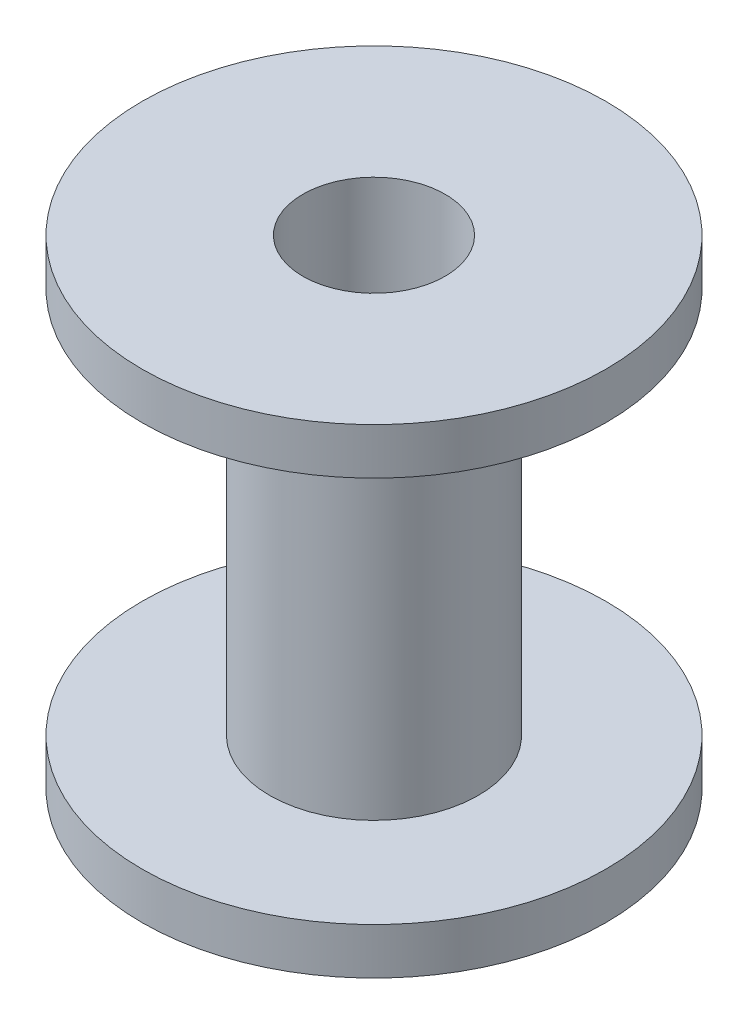
ISO-10303-21;
HEADER;
FILE_DESCRIPTION(('STEP AP214'),'2;1');
FILE_NAME('part.step','',(''),(''),'','','');
FILE_SCHEMA(('AUTOMOTIVE_DESIGN { 1 0 10303 214 1 1 1 1 }'));
ENDSEC;
DATA;
#1=APPLICATION_CONTEXT('core data for automotive mechanical design processes');
#2=APPLICATION_PROTOCOL_DEFINITION('international standard','automotive_design',2000,#1);
#3=PRODUCT_CONTEXT('',#1,'mechanical');
#4=PRODUCT('Part','Part','',(#3));
#5=PRODUCT_RELATED_PRODUCT_CATEGORY('part','',(#4));
#6=PRODUCT_DEFINITION_FORMATION('','',#4);
#7=PRODUCT_DEFINITION_CONTEXT('part definition',#1,'design');
#8=PRODUCT_DEFINITION('design','',#6,#7);
#9=PRODUCT_DEFINITION_SHAPE('','',#8);
#10=(LENGTH_UNIT() NAMED_UNIT(*) SI_UNIT(.MILLI.,.METRE.));
#11=(NAMED_UNIT(*) PLANE_ANGLE_UNIT() SI_UNIT($,.RADIAN.));
#12=(NAMED_UNIT(*) SI_UNIT($,.STERADIAN.) SOLID_ANGLE_UNIT());
#13=UNCERTAINTY_MEASURE_WITH_UNIT(LENGTH_MEASURE(1.E-05),#10,'distance_accuracy_value','');
#14=(GEOMETRIC_REPRESENTATION_CONTEXT(3) GLOBAL_UNCERTAINTY_ASSIGNED_CONTEXT((#13)) GLOBAL_UNIT_ASSIGNED_CONTEXT((#10,
#11,#12)) REPRESENTATION_CONTEXT('',''));
#15=CARTESIAN_POINT('',(0.,0.,0.));
#16=DIRECTION('',(0.,0.,1.));
#17=DIRECTION('',(1.,0.,0.));
#18=AXIS2_PLACEMENT_3D('',#15,#16,#17);
#19=CARTESIAN_POINT('',(0.,15.5,15.));
#20=DIRECTION('',(0.,1.,0.));
#21=DIRECTION('',(0.,0.,1.));
#22=AXIS2_PLACEMENT_3D('',#19,#20,#21);
#23=PLANE('',#22);
#24=CARTESIAN_POINT('',(0.,15.5,0.));
#25=DIRECTION('',(0.,1.,0.));
#26=DIRECTION('',(0.,0.,1.));
#27=AXIS2_PLACEMENT_3D('',#24,#25,#26);
#28=CIRCLE('',#27,15.);
#29=CARTESIAN_POINT('',(0.,15.5,15.));
#30=VERTEX_POINT('',#29);
#31=EDGE_CURVE('E63',#30,#30,#28,.T.);
#32=ORIENTED_EDGE('',*,*,#31,.T.);
#33=EDGE_LOOP('',(#32));
#34=FACE_BOUND('',#33,.T.);
#35=CARTESIAN_POINT('',(0.,15.5,0.));
#36=DIRECTION('',(0.,1.,0.));
#37=DIRECTION('',(0.,0.,1.));
#38=AXIS2_PLACEMENT_3D('',#35,#36,#37);
#39=CIRCLE('',#38,4.6);
#40=CARTESIAN_POINT('',(0.,15.5,4.6));
#41=VERTEX_POINT('',#40);
#42=EDGE_CURVE('E10',#41,#41,#39,.T.);
#43=ORIENTED_EDGE('',*,*,#42,.F.);
#44=EDGE_LOOP('',(#43));
#45=FACE_BOUND('',#44,.T.);
#46=ADVANCED_FACE('F35',(#34,#45),#23,.T.);
#47=CARTESIAN_POINT('',(0.,15.5,0.));
#48=DIRECTION('',(0.,1.,0.));
#49=DIRECTION('',(0.,0.,1.));
#50=AXIS2_PLACEMENT_3D('',#47,#48,#49);
#51=CYLINDRICAL_SURFACE('',#50,4.6);
#52=ORIENTED_EDGE('',*,*,#42,.T.);
#53=EDGE_LOOP('',(#52));
#54=FACE_BOUND('',#53,.T.);
#55=CARTESIAN_POINT('',(0.,-15.5,0.));
#56=DIRECTION('',(0.,1.,0.));
#57=DIRECTION('',(0.,0.,1.));
#58=AXIS2_PLACEMENT_3D('',#55,#56,#57);
#59=CIRCLE('',#58,4.6);
#60=CARTESIAN_POINT('',(0.,-15.5,4.6));
#61=VERTEX_POINT('',#60);
#62=EDGE_CURVE('E41',#61,#61,#59,.T.);
#63=ORIENTED_EDGE('',*,*,#62,.F.);
#64=EDGE_LOOP('',(#63));
#65=FACE_BOUND('',#64,.T.);
#66=ADVANCED_FACE('F81',(#54,#65),#51,.F.);
#67=CARTESIAN_POINT('',(0.,-15.5,15.));
#68=DIRECTION('',(0.,-1.,0.));
#69=DIRECTION('',(0.,0.,-1.));
#70=AXIS2_PLACEMENT_3D('',#67,#68,#69);
#71=PLANE('',#70);
#72=ORIENTED_EDGE('',*,*,#62,.T.);
#73=EDGE_LOOP('',(#72));
#74=FACE_BOUND('',#73,.T.);
#75=CARTESIAN_POINT('',(0.,-15.5,0.));
#76=DIRECTION('',(0.,1.,0.));
#77=DIRECTION('',(0.,0.,1.));
#78=AXIS2_PLACEMENT_3D('',#75,#76,#77);
#79=CIRCLE('',#78,15.);
#80=CARTESIAN_POINT('',(0.,-15.5,15.));
#81=VERTEX_POINT('',#80);
#82=EDGE_CURVE('E45',#81,#81,#79,.T.);
#83=ORIENTED_EDGE('',*,*,#82,.F.);
#84=EDGE_LOOP('',(#83));
#85=FACE_BOUND('',#84,.T.);
#86=ADVANCED_FACE('F85',(#74,#85),#71,.T.);
#87=CARTESIAN_POINT('',(0.,15.5,0.));
#88=DIRECTION('',(0.,1.,0.));
#89=DIRECTION('',(0.,0.,1.));
#90=AXIS2_PLACEMENT_3D('',#87,#88,#89);
#91=CYLINDRICAL_SURFACE('',#90,15.);
#92=ORIENTED_EDGE('',*,*,#82,.T.);
#93=EDGE_LOOP('',(#92));
#94=FACE_BOUND('',#93,.T.);
#95=CARTESIAN_POINT('',(0.,-12.5,0.));
#96=DIRECTION('',(0.,1.,0.));
#97=DIRECTION('',(0.,0.,1.));
#98=AXIS2_PLACEMENT_3D('',#95,#96,#97);
#99=CIRCLE('',#98,15.);
#100=CARTESIAN_POINT('',(0.,-12.5,15.));
#101=VERTEX_POINT('',#100);
#102=EDGE_CURVE('E49',#101,#101,#99,.T.);
#103=ORIENTED_EDGE('',*,*,#102,.F.);
#104=EDGE_LOOP('',(#103));
#105=FACE_BOUND('',#104,.T.);
#106=ADVANCED_FACE('F89',(#94,#105),#91,.T.);
#107=CARTESIAN_POINT('',(0.,-12.5,15.));
#108=DIRECTION('',(0.,1.,0.));
#109=DIRECTION('',(0.,0.,1.));
#110=AXIS2_PLACEMENT_3D('',#107,#108,#109);
#111=PLANE('',#110);
#112=ORIENTED_EDGE('',*,*,#102,.T.);
#113=EDGE_LOOP('',(#112));
#114=FACE_BOUND('',#113,.T.);
#115=CARTESIAN_POINT('',(0.,-12.5,0.));
#116=DIRECTION('',(0.,1.,0.));
#117=DIRECTION('',(0.,0.,1.));
#118=AXIS2_PLACEMENT_3D('',#115,#116,#117);
#119=CIRCLE('',#118,6.75);
#120=CARTESIAN_POINT('',(0.,-12.5,6.75));
#121=VERTEX_POINT('',#120);
#122=EDGE_CURVE('E54',#121,#121,#119,.T.);
#123=ORIENTED_EDGE('',*,*,#122,.F.);
#124=EDGE_LOOP('',(#123));
#125=FACE_BOUND('',#124,.T.);
#126=ADVANCED_FACE('F95',(#114,#125),#111,.T.);
#127=CARTESIAN_POINT('',(0.,15.5,0.));
#128=DIRECTION('',(0.,1.,0.));
#129=DIRECTION('',(0.,0.,1.));
#130=AXIS2_PLACEMENT_3D('',#127,#128,#129);
#131=CYLINDRICAL_SURFACE('',#130,6.75);
#132=ORIENTED_EDGE('',*,*,#122,.T.);
#133=EDGE_LOOP('',(#132));
#134=FACE_BOUND('',#133,.T.);
#135=CARTESIAN_POINT('',(0.,12.5,0.));
#136=DIRECTION('',(0.,1.,0.));
#137=DIRECTION('',(0.,0.,1.));
#138=AXIS2_PLACEMENT_3D('',#135,#136,#137);
#139=CIRCLE('',#138,6.75);
#140=CARTESIAN_POINT('',(0.,12.5,6.75));
#141=VERTEX_POINT('',#140);
#142=EDGE_CURVE('E57',#141,#141,#139,.T.);
#143=ORIENTED_EDGE('',*,*,#142,.F.);
#144=EDGE_LOOP('',(#143));
#145=FACE_BOUND('',#144,.T.);
#146=ADVANCED_FACE('F77',(#134,#145),#131,.T.);
#147=CARTESIAN_POINT('',(0.,12.5,15.));
#148=DIRECTION('',(0.,-1.,0.));
#149=DIRECTION('',(0.,0.,-1.));
#150=AXIS2_PLACEMENT_3D('',#147,#148,#149);
#151=PLANE('',#150);
#152=ORIENTED_EDGE('',*,*,#142,.T.);
#153=EDGE_LOOP('',(#152));
#154=FACE_BOUND('',#153,.T.);
#155=CARTESIAN_POINT('',(0.,12.5,0.));
#156=DIRECTION('',(0.,1.,0.));
#157=DIRECTION('',(0.,0.,1.));
#158=AXIS2_PLACEMENT_3D('',#155,#156,#157);
#159=CIRCLE('',#158,15.);
#160=CARTESIAN_POINT('',(0.,12.5,15.));
#161=VERTEX_POINT('',#160);
#162=EDGE_CURVE('E60',#161,#161,#159,.T.);
#163=ORIENTED_EDGE('',*,*,#162,.F.);
#164=EDGE_LOOP('',(#163));
#165=FACE_BOUND('',#164,.T.);
#166=ADVANCED_FACE('F71',(#154,#165),#151,.T.);
#167=CARTESIAN_POINT('',(0.,15.5,0.));
#168=DIRECTION('',(0.,1.,0.));
#169=DIRECTION('',(0.,0.,1.));
#170=AXIS2_PLACEMENT_3D('',#167,#168,#169);
#171=CYLINDRICAL_SURFACE('',#170,15.);
#172=ORIENTED_EDGE('',*,*,#162,.T.);
#173=EDGE_LOOP('',(#172));
#174=FACE_BOUND('',#173,.T.);
#175=ORIENTED_EDGE('',*,*,#31,.F.);
#176=EDGE_LOOP('',(#175));
#177=FACE_BOUND('',#176,.T.);
#178=ADVANCED_FACE('F69',(#174,#177),#171,.T.);
#179=CLOSED_SHELL('',(#46,#66,#86,#106,#126,#146,#166,#178));
#180=MANIFOLD_SOLID_BREP('B2',#179);
#181=ADVANCED_BREP_SHAPE_REPRESENTATION('',(#18,#180),#14);
#182=SHAPE_DEFINITION_REPRESENTATION(#9,#181);
ENDSEC;
END-ISO-10303-21;
